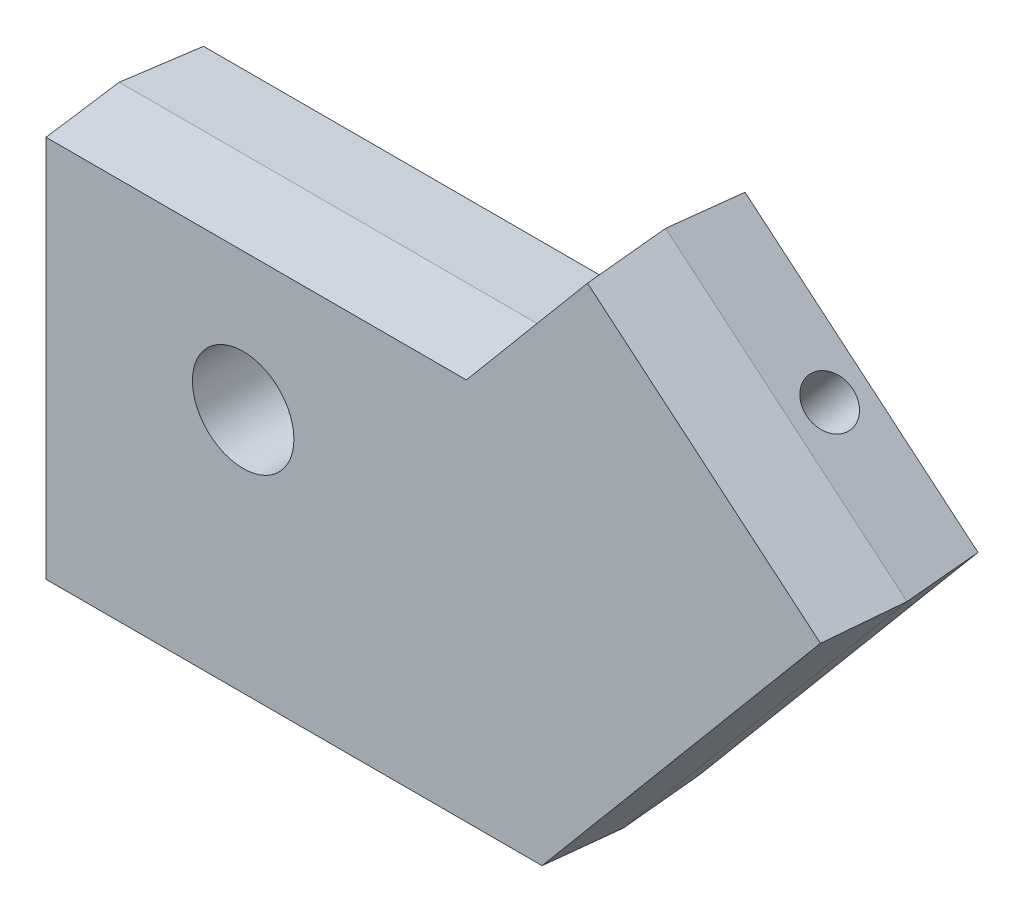
ISO-10303-21;
HEADER;
FILE_DESCRIPTION(('STEP AP214'),'2;1');
FILE_NAME('part.step','',(''),(''),'','','');
FILE_SCHEMA(('AUTOMOTIVE_DESIGN { 1 0 10303 214 1 1 1 1 }'));
ENDSEC;
DATA;
#1=APPLICATION_CONTEXT('core data for automotive mechanical design processes');
#2=APPLICATION_PROTOCOL_DEFINITION('international standard','automotive_design',2000,#1);
#3=PRODUCT_CONTEXT('',#1,'mechanical');
#4=PRODUCT('Part','Part','',(#3));
#5=PRODUCT_RELATED_PRODUCT_CATEGORY('part','',(#4));
#6=PRODUCT_DEFINITION_FORMATION('','',#4);
#7=PRODUCT_DEFINITION_CONTEXT('part definition',#1,'design');
#8=PRODUCT_DEFINITION('design','',#6,#7);
#9=PRODUCT_DEFINITION_SHAPE('','',#8);
#10=(LENGTH_UNIT() NAMED_UNIT(*) SI_UNIT(.MILLI.,.METRE.));
#11=(NAMED_UNIT(*) PLANE_ANGLE_UNIT() SI_UNIT($,.RADIAN.));
#12=(NAMED_UNIT(*) SI_UNIT($,.STERADIAN.) SOLID_ANGLE_UNIT());
#13=UNCERTAINTY_MEASURE_WITH_UNIT(LENGTH_MEASURE(1.E-05),#10,'distance_accuracy_value','');
#14=(GEOMETRIC_REPRESENTATION_CONTEXT(3) GLOBAL_UNCERTAINTY_ASSIGNED_CONTEXT((#13)) GLOBAL_UNIT_ASSIGNED_CONTEXT((#10,
#11,#12)) REPRESENTATION_CONTEXT('',''));
#15=CARTESIAN_POINT('',(0.,0.,0.));
#16=DIRECTION('',(0.,0.,1.));
#17=DIRECTION('',(1.,0.,0.));
#18=AXIS2_PLACEMENT_3D('',#15,#16,#17);
#19=CARTESIAN_POINT('',(0.,0.,0.));
#20=DIRECTION('',(-0.997564050259824,0.,-0.0697564737441253));
#21=DIRECTION('',(-0.0697564737441253,0.,0.997564050259824));
#22=AXIS2_PLACEMENT_3D('',#19,#20,#21);
#23=PLANE('',#22);
#24=DIRECTION('',(0.,-1.,0.));
#25=VECTOR('',#24,1.);
#26=CARTESIAN_POINT('',(0.,0.,0.));
#27=LINE('',#26,#25);
#28=CARTESIAN_POINT('',(0.,25.,0.));
#29=VERTEX_POINT('',#28);
#30=CARTESIAN_POINT('',(0.,0.,0.));
#31=VERTEX_POINT('',#30);
#32=EDGE_CURVE('E124',#29,#31,#27,.T.);
#33=ORIENTED_EDGE('',*,*,#32,.F.);
#34=DIRECTION('',(-0.0695873743166647,0.0695873743166647,0.995145815783508));
#35=VECTOR('',#34,1.);
#36=CARTESIAN_POINT('',(0.,25.,0.));
#37=LINE('',#36,#35);
#38=CARTESIAN_POINT('',(0.349634059717552,24.6503659402824,-5.));
#39=VERTEX_POINT('',#38);
#40=EDGE_CURVE('E11',#39,#29,#37,.T.);
#41=ORIENTED_EDGE('',*,*,#40,.F.);
#42=DIRECTION('',(0.,-1.,0.));
#43=VECTOR('',#42,1.);
#44=CARTESIAN_POINT('',(0.349634059717552,0.,-5.));
#45=LINE('',#44,#43);
#46=CARTESIAN_POINT('',(0.349634059717552,0.349634059717552,-5.));
#47=VERTEX_POINT('',#46);
#48=EDGE_CURVE('E149',#39,#47,#45,.T.);
#49=ORIENTED_EDGE('',*,*,#48,.T.);
#50=DIRECTION('',(-0.0695873743166647,-0.0695873743166647,0.995145815783508));
#51=VECTOR('',#50,1.);
#52=CARTESIAN_POINT('',(0.,0.,0.));
#53=LINE('',#52,#51);
#54=EDGE_CURVE('E83',#47,#31,#53,.T.);
#55=ORIENTED_EDGE('',*,*,#54,.T.);
#56=EDGE_LOOP('',(#33,#41,#49,#55));
#57=FACE_BOUND('',#56,.T.);
#58=ADVANCED_FACE('F39',(#57),#23,.T.);
#59=CARTESIAN_POINT('',(0.,25.,0.));
#60=DIRECTION('',(0.,0.997564050259824,-0.0697564737441253));
#61=DIRECTION('',(0.,0.0697564737441253,0.997564050259824));
#62=AXIS2_PLACEMENT_3D('',#59,#60,#61);
#63=PLANE('',#62);
#64=DIRECTION('',(-1.,0.,0.));
#65=VECTOR('',#64,1.);
#66=CARTESIAN_POINT('',(0.,25.,0.));
#67=LINE('',#66,#65);
#68=CARTESIAN_POINT('',(26.8693449927864,25.,0.));
#69=VERTEX_POINT('',#68);
#70=EDGE_CURVE('E135',#69,#29,#67,.T.);
#71=ORIENTED_EDGE('',*,*,#70,.F.);
#72=DIRECTION('',(-0.0325107831283509,0.0697195994099336,0.99703672271311));
#73=VECTOR('',#72,1.);
#74=CARTESIAN_POINT('',(26.8409454111998,25.0609030992521,0.870954896403161));
#75=LINE('',#74,#73);
#76=CARTESIAN_POINT('',(27.0323820323845,24.6503659402824,-5.));
#77=VERTEX_POINT('',#76);
#78=EDGE_CURVE('E50',#77,#69,#75,.T.);
#79=ORIENTED_EDGE('',*,*,#78,.F.);
#80=DIRECTION('',(-1.,0.,0.));
#81=VECTOR('',#80,1.);
#82=CARTESIAN_POINT('',(0.,24.6503659402824,-5.));
#83=LINE('',#82,#81);
#84=EDGE_CURVE('E138',#77,#39,#83,.T.);
#85=ORIENTED_EDGE('',*,*,#84,.T.);
#86=ORIENTED_EDGE('',*,*,#40,.T.);
#87=EDGE_LOOP('',(#71,#79,#85,#86));
#88=FACE_BOUND('',#87,.T.);
#89=ADVANCED_FACE('F41',(#88),#63,.T.);
#90=CARTESIAN_POINT('',(34.6791111376204,34.3073168604266,0.));
#91=DIRECTION('',(-0.764178397356801,0.641221811375733,-0.0697564737441253));
#92=DIRECTION('',(-0.642787609686537,-0.76604444311898,0.));
#93=AXIS2_PLACEMENT_3D('',#90,#91,#92);
#94=PLANE('',#93);
#95=DIRECTION('',(-0.642787609686537,-0.76604444311898,0.));
#96=VECTOR('',#95,1.);
#97=CARTESIAN_POINT('',(34.6791111376204,34.3073168604266,0.));
#98=LINE('',#97,#96);
#99=CARTESIAN_POINT('',(34.6791111376204,34.3073168604266,0.));
#100=VERTEX_POINT('',#99);
#101=EDGE_CURVE('E150',#100,#69,#98,.T.);
#102=ORIENTED_EDGE('',*,*,#101,.F.);
#103=DIRECTION('',(-0.0085771194051502,0.0980369234078926,0.995145815783509));
#104=VECTOR('',#103,1.);
#105=CARTESIAN_POINT('',(34.6910483219925,34.1708742187059,-1.38499168765179));
#106=LINE('',#105,#104);
#107=CARTESIAN_POINT('',(34.7222059246813,33.814741190344,-5.));
#108=VERTEX_POINT('',#107);
#109=EDGE_CURVE('E96',#108,#100,#106,.T.);
#110=ORIENTED_EDGE('',*,*,#109,.F.);
#111=DIRECTION('',(-0.642787609686537,-0.76604444311898,0.));
#112=VECTOR('',#111,1.);
#113=CARTESIAN_POINT('',(34.9469463661922,34.0825764189158,-5.));
#114=LINE('',#113,#112);
#115=EDGE_CURVE('E220',#108,#77,#114,.T.);
#116=ORIENTED_EDGE('',*,*,#115,.T.);
#117=ORIENTED_EDGE('',*,*,#78,.T.);
#118=EDGE_LOOP('',(#102,#110,#116,#117));
#119=FACE_BOUND('',#118,.T.);
#120=ADVANCED_FACE('F251',(#119),#94,.T.);
#121=CARTESIAN_POINT('',(50.,21.4515646666959,0.));
#122=DIRECTION('',(0.641221811375733,0.764178397356801,-0.0697564737441253));
#123=DIRECTION('',(-0.76604444311898,0.642787609686537,0.));
#124=AXIS2_PLACEMENT_3D('',#121,#122,#123);
#125=PLANE('',#124);
#126=CARTESIAN_POINT('',(42.586054740247,27.4439246848222,-2.50516295453286));
#127=DIRECTION('',(0.641221811375733,0.764178397356801,-0.0697564737441253));
#128=DIRECTION('',(-0.76604444311898,0.642787609686537,0.));
#129=AXIS2_PLACEMENT_3D('',#126,#127,#128);
#130=CIRCLE('',#129,1.55009844914351);
#131=CARTESIAN_POINT('',(41.3986104369933,28.440308761726,-2.50516295453286));
#132=VERTEX_POINT('',#131);
#133=EDGE_CURVE('E380',#132,#132,#130,.T.);
#134=ORIENTED_EDGE('',*,*,#133,.F.);
#135=EDGE_LOOP('',(#134));
#136=FACE_BOUND('',#135,.T.);
#137=DIRECTION('',(-0.76604444311898,0.642787609686537,0.));
#138=VECTOR('',#137,1.);
#139=CARTESIAN_POINT('',(50.,21.4515646666959,0.));
#140=LINE('',#139,#138);
#141=CARTESIAN_POINT('',(50.,21.4515646666959,0.));
#142=VERTEX_POINT('',#141);
#143=EDGE_CURVE('E199',#142,#100,#140,.T.);
#144=ORIENTED_EDGE('',*,*,#143,.F.);
#145=DIRECTION('',(0.0980369234078926,0.00857711940515017,0.995145815783508));
#146=VECTOR('',#145,1.);
#147=CARTESIAN_POINT('',(49.8089596381477,21.4348508007579,-1.93919811163516));
#148=LINE('',#147,#146);
#149=CARTESIAN_POINT('',(49.5074243299174,21.408469879635,-5.));
#150=VERTEX_POINT('',#149);
#151=EDGE_CURVE('E209',#150,#142,#148,.T.);
#152=ORIENTED_EDGE('',*,*,#151,.F.);
#153=DIRECTION('',(-0.76604444311898,0.642787609686537,0.));
#154=VECTOR('',#153,1.);
#155=CARTESIAN_POINT('',(49.7752595584892,21.1837294381241,-5.));
#156=LINE('',#155,#154);
#157=EDGE_CURVE('E223',#150,#108,#156,.T.);
#158=ORIENTED_EDGE('',*,*,#157,.T.);
#159=ORIENTED_EDGE('',*,*,#109,.T.);
#160=EDGE_LOOP('',(#144,#152,#158,#159));
#161=FACE_BOUND('',#160,.T.);
#162=ADVANCED_FACE('F233',(#136,#161),#125,.T.);
#163=CARTESIAN_POINT('',(32.,0.,0.));
#164=DIRECTION('',(0.764178397356801,-0.641221811375733,-0.0697564737441253));
#165=DIRECTION('',(0.642787609686537,0.76604444311898,0.));
#166=AXIS2_PLACEMENT_3D('',#163,#164,#165);
#167=PLANE('',#166);
#168=DIRECTION('',(0.642787609686537,0.76604444311898,0.));
#169=VECTOR('',#168,1.);
#170=CARTESIAN_POINT('',(32.,0.,0.));
#171=LINE('',#170,#169);
#172=CARTESIAN_POINT('',(32.,0.,0.));
#173=VERTEX_POINT('',#172);
#174=EDGE_CURVE('E195',#173,#142,#171,.T.);
#175=ORIENTED_EDGE('',*,*,#174,.F.);
#176=DIRECTION('',(0.0325107831283509,-0.0697195994099336,0.99703672271311));
#177=VECTOR('',#176,1.);
#178=CARTESIAN_POINT('',(31.9661775673722,0.0725324408387792,-1.03726222922008));
#179=LINE('',#178,#177);
#180=CARTESIAN_POINT('',(31.8369629604019,0.349634059717552,-5.));
#181=VERTEX_POINT('',#180);
#182=EDGE_CURVE('E76',#181,#173,#179,.T.);
#183=ORIENTED_EDGE('',*,*,#182,.F.);
#184=DIRECTION('',(0.642787609686537,0.76604444311898,0.));
#185=VECTOR('',#184,1.);
#186=CARTESIAN_POINT('',(31.7321647714282,0.224740441510845,-5.));
#187=LINE('',#186,#185);
#188=EDGE_CURVE('E225',#181,#150,#187,.T.);
#189=ORIENTED_EDGE('',*,*,#188,.T.);
#190=ORIENTED_EDGE('',*,*,#151,.T.);
#191=EDGE_LOOP('',(#175,#183,#189,#190));
#192=FACE_BOUND('',#191,.T.);
#193=ADVANCED_FACE('F234',(#192),#167,.T.);
#194=CARTESIAN_POINT('',(0.,0.,0.));
#195=DIRECTION('',(0.,-0.997564050259824,-0.0697564737441253));
#196=DIRECTION('',(0.,0.0697564737441253,-0.997564050259824));
#197=AXIS2_PLACEMENT_3D('',#194,#195,#196);
#198=PLANE('',#197);
#199=DIRECTION('',(1.,0.,0.));
#200=VECTOR('',#199,1.);
#201=CARTESIAN_POINT('',(0.,0.,0.));
#202=LINE('',#201,#200);
#203=EDGE_CURVE('E129',#31,#173,#202,.T.);
#204=ORIENTED_EDGE('',*,*,#203,.F.);
#205=ORIENTED_EDGE('',*,*,#54,.F.);
#206=DIRECTION('',(1.,0.,0.));
#207=VECTOR('',#206,1.);
#208=CARTESIAN_POINT('',(0.,0.349634059717552,-5.));
#209=LINE('',#208,#207);
#210=EDGE_CURVE('E43',#47,#181,#209,.T.);
#211=ORIENTED_EDGE('',*,*,#210,.T.);
#212=ORIENTED_EDGE('',*,*,#182,.T.);
#213=EDGE_LOOP('',(#204,#205,#211,#212));
#214=FACE_BOUND('',#213,.T.);
#215=ADVANCED_FACE('F228',(#214),#198,.T.);
#216=CARTESIAN_POINT('',(0.,0.,-5.));
#217=DIRECTION('',(0.,0.,-1.));
#218=DIRECTION('',(-1.,0.,0.));
#219=AXIS2_PLACEMENT_3D('',#216,#217,#218);
#220=PLANE('',#219);
#221=CARTESIAN_POINT('',(12.864998103906,15.9191452503077,-4.99999999999999));
#222=DIRECTION('',(0.,0.,1.));
#223=DIRECTION('',(1.,0.,0.));
#224=AXIS2_PLACEMENT_3D('',#221,#222,#223);
#225=CIRCLE('',#224,3.21994509347072);
#226=CARTESIAN_POINT('',(16.0849431973767,15.9191452503077,-4.99999999999999));
#227=VERTEX_POINT('',#226);
#228=EDGE_CURVE('E181',#227,#227,#225,.T.);
#229=ORIENTED_EDGE('',*,*,#228,.T.);
#230=EDGE_LOOP('',(#229));
#231=FACE_BOUND('',#230,.T.);
#232=ORIENTED_EDGE('',*,*,#48,.F.);
#233=ORIENTED_EDGE('',*,*,#84,.F.);
#234=ORIENTED_EDGE('',*,*,#115,.F.);
#235=ORIENTED_EDGE('',*,*,#157,.F.);
#236=ORIENTED_EDGE('',*,*,#188,.F.);
#237=ORIENTED_EDGE('',*,*,#210,.F.);
#238=EDGE_LOOP('',(#232,#233,#234,#235,#236,#237));
#239=FACE_BOUND('',#238,.T.);
#240=ADVANCED_FACE('F230',(#231,#239),#220,.T.);
#241=CARTESIAN_POINT('',(0.,0.,0.));
#242=DIRECTION('',(-0.997564050259824,0.,0.0697564737441253));
#243=DIRECTION('',(0.0697564737441253,0.,0.997564050259824));
#244=AXIS2_PLACEMENT_3D('',#241,#242,#243);
#245=PLANE('',#244);
#246=ORIENTED_EDGE('',*,*,#32,.T.);
#247=DIRECTION('',(-0.0695873743166647,-0.0695873743166647,-0.995145815783508));
#248=VECTOR('',#247,1.);
#249=CARTESIAN_POINT('',(0.,0.,0.));
#250=LINE('',#249,#248);
#251=CARTESIAN_POINT('',(0.349634059717552,0.349634059717552,5.));
#252=VERTEX_POINT('',#251);
#253=EDGE_CURVE('E130',#252,#31,#250,.T.);
#254=ORIENTED_EDGE('',*,*,#253,.F.);
#255=DIRECTION('',(0.,1.,0.));
#256=VECTOR('',#255,1.);
#257=CARTESIAN_POINT('',(0.349634059717552,0.,5.));
#258=LINE('',#257,#256);
#259=CARTESIAN_POINT('',(0.349634059717552,24.6503659402824,5.));
#260=VERTEX_POINT('',#259);
#261=EDGE_CURVE('E154',#260,#252,#258,.F.);
#262=ORIENTED_EDGE('',*,*,#261,.F.);
#263=DIRECTION('',(-0.0695873743166647,0.0695873743166647,-0.995145815783508));
#264=VECTOR('',#263,1.);
#265=CARTESIAN_POINT('',(0.12106006660719,24.8789399333928,1.73123960956474));
#266=LINE('',#265,#264);
#267=EDGE_CURVE('E144',#260,#29,#266,.T.);
#268=ORIENTED_EDGE('',*,*,#267,.T.);
#269=EDGE_LOOP('',(#246,#254,#262,#268));
#270=FACE_BOUND('',#269,.T.);
#271=ADVANCED_FACE('F152',(#270),#245,.T.);
#272=CARTESIAN_POINT('',(0.,0.,0.));
#273=DIRECTION('',(0.,-0.997564050259824,0.0697564737441253));
#274=DIRECTION('',(0.,-0.0697564737441253,-0.997564050259824));
#275=AXIS2_PLACEMENT_3D('',#272,#273,#274);
#276=PLANE('',#275);
#277=ORIENTED_EDGE('',*,*,#203,.T.);
#278=DIRECTION('',(0.0325107831283509,-0.0697195994099336,-0.99703672271311));
#279=VECTOR('',#278,1.);
#280=CARTESIAN_POINT('',(32.,0.,0.));
#281=LINE('',#280,#279);
#282=CARTESIAN_POINT('',(31.8369629604019,0.349634059717552,5.));
#283=VERTEX_POINT('',#282);
#284=EDGE_CURVE('E174',#283,#173,#281,.T.);
#285=ORIENTED_EDGE('',*,*,#284,.F.);
#286=DIRECTION('',(-1.,0.,0.));
#287=VECTOR('',#286,1.);
#288=CARTESIAN_POINT('',(0.,0.349634059717552,5.));
#289=LINE('',#288,#287);
#290=EDGE_CURVE('E180',#252,#283,#289,.F.);
#291=ORIENTED_EDGE('',*,*,#290,.F.);
#292=ORIENTED_EDGE('',*,*,#253,.T.);
#293=EDGE_LOOP('',(#277,#285,#291,#292));
#294=FACE_BOUND('',#293,.T.);
#295=ADVANCED_FACE('F240',(#294),#276,.T.);
#296=CARTESIAN_POINT('',(32.,0.,0.));
#297=DIRECTION('',(0.764178397356801,-0.641221811375733,0.0697564737441253));
#298=DIRECTION('',(0.642787609686537,0.76604444311898,0.));
#299=AXIS2_PLACEMENT_3D('',#296,#297,#298);
#300=PLANE('',#299);
#301=ORIENTED_EDGE('',*,*,#174,.T.);
#302=DIRECTION('',(0.0980369234078926,0.00857711940515017,-0.995145815783508));
#303=VECTOR('',#302,1.);
#304=CARTESIAN_POINT('',(50.,21.4515646666959,0.));
#305=LINE('',#304,#303);
#306=CARTESIAN_POINT('',(49.5074243299174,21.408469879635,5.));
#307=VERTEX_POINT('',#306);
#308=EDGE_CURVE('E170',#307,#142,#305,.T.);
#309=ORIENTED_EDGE('',*,*,#308,.F.);
#310=DIRECTION('',(-0.642787609686537,-0.76604444311898,0.));
#311=VECTOR('',#310,1.);
#312=CARTESIAN_POINT('',(18.5105356140992,-15.5321836066845,5.));
#313=LINE('',#312,#311);
#314=EDGE_CURVE('E184',#283,#307,#313,.F.);
#315=ORIENTED_EDGE('',*,*,#314,.F.);
#316=ORIENTED_EDGE('',*,*,#284,.T.);
#317=EDGE_LOOP('',(#301,#309,#315,#316));
#318=FACE_BOUND('',#317,.T.);
#319=ADVANCED_FACE('F242',(#318),#300,.T.);
#320=CARTESIAN_POINT('',(50.,21.4515646666959,0.));
#321=DIRECTION('',(0.641221811375733,0.764178397356801,0.0697564737441253));
#322=DIRECTION('',(-0.76604444311898,0.642787609686537,0.));
#323=AXIS2_PLACEMENT_3D('',#320,#321,#322);
#324=PLANE('',#323);
#325=ORIENTED_EDGE('',*,*,#143,.T.);
#326=DIRECTION('',(-0.0085771194051502,0.0980369234078926,-0.995145815783509));
#327=VECTOR('',#326,1.);
#328=CARTESIAN_POINT('',(34.6791111376204,34.3073168604266,0.));
#329=LINE('',#328,#327);
#330=CARTESIAN_POINT('',(34.7222059246813,33.814741190344,5.));
#331=VERTEX_POINT('',#330);
#332=EDGE_CURVE('E160',#331,#100,#329,.T.);
#333=ORIENTED_EDGE('',*,*,#332,.F.);
#334=DIRECTION('',(0.76604444311898,-0.642787609686537,0.));
#335=VECTOR('',#334,1.);
#336=CARTESIAN_POINT('',(30.9968887158182,36.9406534863195,5.));
#337=LINE('',#336,#335);
#338=EDGE_CURVE('E187',#307,#331,#337,.F.);
#339=ORIENTED_EDGE('',*,*,#338,.F.);
#340=ORIENTED_EDGE('',*,*,#308,.T.);
#341=EDGE_LOOP('',(#325,#333,#339,#340));
#342=FACE_BOUND('',#341,.T.);
#343=ADVANCED_FACE('F253',(#342),#324,.T.);
#344=CARTESIAN_POINT('',(34.6791111376204,34.3073168604266,0.));
#345=DIRECTION('',(-0.764178397356801,0.641221811375733,0.0697564737441253));
#346=DIRECTION('',(-0.642787609686537,-0.76604444311898,0.));
#347=AXIS2_PLACEMENT_3D('',#344,#345,#346);
#348=PLANE('',#347);
#349=ORIENTED_EDGE('',*,*,#101,.T.);
#350=DIRECTION('',(-0.0325107831283509,0.0697195994099336,-0.99703672271311));
#351=VECTOR('',#350,1.);
#352=CARTESIAN_POINT('',(26.8565032077778,25.0275392968226,-0.39383029280409));
#353=LINE('',#352,#351);
#354=CARTESIAN_POINT('',(27.0323820323845,24.6503659402824,5.));
#355=VERTEX_POINT('',#354);
#356=EDGE_CURVE('E147',#355,#69,#353,.T.);
#357=ORIENTED_EDGE('',*,*,#356,.F.);
#358=DIRECTION('',(0.642787609686537,0.76604444311898,0.));
#359=VECTOR('',#358,1.);
#360=CARTESIAN_POINT('',(3.72531720886316,-3.12591229597543,5.));
#361=LINE('',#360,#359);
#362=EDGE_CURVE('E162',#331,#355,#361,.F.);
#363=ORIENTED_EDGE('',*,*,#362,.F.);
#364=ORIENTED_EDGE('',*,*,#332,.T.);
#365=EDGE_LOOP('',(#349,#357,#363,#364));
#366=FACE_BOUND('',#365,.T.);
#367=ADVANCED_FACE('F250',(#366),#348,.T.);
#368=CARTESIAN_POINT('',(0.,25.,0.));
#369=DIRECTION('',(0.,0.997564050259824,0.0697564737441253));
#370=DIRECTION('',(0.,-0.0697564737441253,0.997564050259824));
#371=AXIS2_PLACEMENT_3D('',#368,#369,#370);
#372=PLANE('',#371);
#373=ORIENTED_EDGE('',*,*,#70,.T.);
#374=ORIENTED_EDGE('',*,*,#267,.F.);
#375=DIRECTION('',(1.,0.,0.));
#376=VECTOR('',#375,1.);
#377=CARTESIAN_POINT('',(0.,24.6503659402824,5.));
#378=LINE('',#377,#376);
#379=EDGE_CURVE('E156',#355,#260,#378,.F.);
#380=ORIENTED_EDGE('',*,*,#379,.F.);
#381=ORIENTED_EDGE('',*,*,#356,.T.);
#382=EDGE_LOOP('',(#373,#374,#380,#381));
#383=FACE_BOUND('',#382,.T.);
#384=ADVANCED_FACE('F142',(#383),#372,.T.);
#385=CARTESIAN_POINT('',(0.,0.,5.));
#386=DIRECTION('',(0.,0.,-1.));
#387=DIRECTION('',(-1.,0.,0.));
#388=AXIS2_PLACEMENT_3D('',#385,#386,#387);
#389=PLANE('',#388);
#390=CARTESIAN_POINT('',(12.864998103906,15.9191452503077,5.));
#391=DIRECTION('',(0.,0.,1.));
#392=DIRECTION('',(1.,0.,0.));
#393=AXIS2_PLACEMENT_3D('',#390,#391,#392);
#394=CIRCLE('',#393,3.21994509347072);
#395=CARTESIAN_POINT('',(16.0849431973767,15.9191452503077,5.));
#396=VERTEX_POINT('',#395);
#397=EDGE_CURVE('E379',#396,#396,#394,.T.);
#398=ORIENTED_EDGE('',*,*,#397,.F.);
#399=EDGE_LOOP('',(#398));
#400=FACE_BOUND('',#399,.T.);
#401=ORIENTED_EDGE('',*,*,#261,.T.);
#402=ORIENTED_EDGE('',*,*,#290,.T.);
#403=ORIENTED_EDGE('',*,*,#314,.T.);
#404=ORIENTED_EDGE('',*,*,#338,.T.);
#405=ORIENTED_EDGE('',*,*,#362,.T.);
#406=ORIENTED_EDGE('',*,*,#379,.T.);
#407=EDGE_LOOP('',(#401,#402,#403,#404,#405,#406));
#408=FACE_BOUND('',#407,.T.);
#409=ADVANCED_FACE('F245',(#400,#408),#389,.F.);
#410=CARTESIAN_POINT('',(12.864998103906,15.9191452503077,-4.99999999999999));
#411=DIRECTION('',(0.,0.,1.));
#412=DIRECTION('',(1.,0.,0.));
#413=AXIS2_PLACEMENT_3D('',#410,#411,#412);
#414=CYLINDRICAL_SURFACE('',#413,3.21994509347072);
#415=ORIENTED_EDGE('',*,*,#228,.F.);
#416=EDGE_LOOP('',(#415));
#417=FACE_BOUND('',#416,.T.);
#418=ORIENTED_EDGE('',*,*,#397,.T.);
#419=EDGE_LOOP('',(#418));
#420=FACE_BOUND('',#419,.T.);
#421=ADVANCED_FACE('F343',(#417,#420),#414,.F.);
#422=CARTESIAN_POINT('',(34.8913930037382,18.2737839165406,-1.66808526960336));
#423=DIRECTION('',(0.641221811375733,0.764178397356801,-0.0697564737441253));
#424=DIRECTION('',(-0.76604444311898,0.642787609686537,0.));
#425=AXIS2_PLACEMENT_3D('',#422,#423,#424);
#426=CYLINDRICAL_SURFACE('',#425,1.55009844914351);
#427=CARTESIAN_POINT('',(34.8913930037382,18.2737839165406,-1.66808526960336));
#428=DIRECTION('',(0.641221811375733,0.764178397356801,-0.0697564737441253));
#429=DIRECTION('',(-0.76604444311898,0.642787609686537,0.));
#430=AXIS2_PLACEMENT_3D('',#427,#428,#429);
#431=CIRCLE('',#430,1.55009844914351);
#432=CARTESIAN_POINT('',(33.7039487004845,19.2701679934444,-1.66808526960336));
#433=VERTEX_POINT('',#432);
#434=EDGE_CURVE('E377',#433,#433,#431,.T.);
#435=ORIENTED_EDGE('',*,*,#434,.F.);
#436=EDGE_LOOP('',(#435));
#437=FACE_BOUND('',#436,.T.);
#438=ORIENTED_EDGE('',*,*,#133,.T.);
#439=EDGE_LOOP('',(#438));
#440=FACE_BOUND('',#439,.T.);
#441=ADVANCED_FACE('F349',(#437,#440),#426,.F.);
#442=CARTESIAN_POINT('',(34.8913930037382,18.2737839165406,-1.66808526960336));
#443=DIRECTION('',(0.641221811375733,0.764178397356801,-0.0697564737441253));
#444=DIRECTION('',(-0.76604444311898,0.642787609686537,0.));
#445=AXIS2_PLACEMENT_3D('',#442,#443,#444);
#446=PLANE('',#445);
#447=ORIENTED_EDGE('',*,*,#434,.T.);
#448=EDGE_LOOP('',(#447));
#449=FACE_BOUND('',#448,.T.);
#450=ADVANCED_FACE('F356',(#449),#446,.T.);
#451=CLOSED_SHELL('',(#58,#89,#120,#162,#193,#215,#240,#271,#295,#319,#343,#367,#384,#409,#421,
#441,#450));
#452=MANIFOLD_SOLID_BREP('B2',#451);
#453=ADVANCED_BREP_SHAPE_REPRESENTATION('',(#18,#452),#14);
#454=SHAPE_DEFINITION_REPRESENTATION(#9,#453);
ENDSEC;
END-ISO-10303-21;
